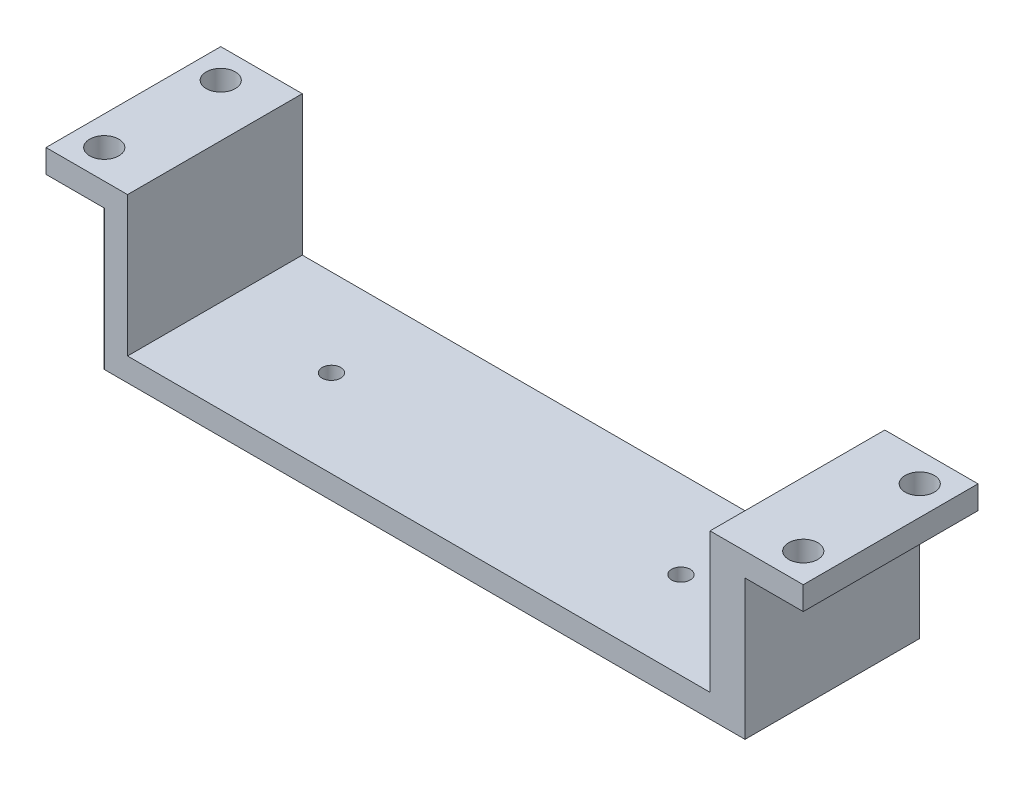
ISO-10303-21;
HEADER;
FILE_DESCRIPTION(('STEP AP214'),'2;1');
FILE_NAME('part.step','',(''),(''),'','','');
FILE_SCHEMA(('AUTOMOTIVE_DESIGN { 1 0 10303 214 1 1 1 1 }'));
ENDSEC;
DATA;
#1=APPLICATION_CONTEXT('core data for automotive mechanical design processes');
#2=APPLICATION_PROTOCOL_DEFINITION('international standard','automotive_design',2000,#1);
#3=PRODUCT_CONTEXT('',#1,'mechanical');
#4=PRODUCT('Part','Part','',(#3));
#5=PRODUCT_RELATED_PRODUCT_CATEGORY('part','',(#4));
#6=PRODUCT_DEFINITION_FORMATION('','',#4);
#7=PRODUCT_DEFINITION_CONTEXT('part definition',#1,'design');
#8=PRODUCT_DEFINITION('design','',#6,#7);
#9=PRODUCT_DEFINITION_SHAPE('','',#8);
#10=(LENGTH_UNIT() NAMED_UNIT(*) SI_UNIT(.MILLI.,.METRE.));
#11=(NAMED_UNIT(*) PLANE_ANGLE_UNIT() SI_UNIT($,.RADIAN.));
#12=(NAMED_UNIT(*) SI_UNIT($,.STERADIAN.) SOLID_ANGLE_UNIT());
#13=UNCERTAINTY_MEASURE_WITH_UNIT(LENGTH_MEASURE(1.E-05),#10,'distance_accuracy_value','');
#14=(GEOMETRIC_REPRESENTATION_CONTEXT(3) GLOBAL_UNCERTAINTY_ASSIGNED_CONTEXT((#13)) GLOBAL_UNIT_ASSIGNED_CONTEXT((#10,
#11,#12)) REPRESENTATION_CONTEXT('',''));
#15=CARTESIAN_POINT('',(0.,0.,0.));
#16=DIRECTION('',(0.,0.,1.));
#17=DIRECTION('',(1.,0.,0.));
#18=AXIS2_PLACEMENT_3D('',#15,#16,#17);
#19=CARTESIAN_POINT('',(0.,2.,15.));
#20=DIRECTION('',(0.,0.,-1.));
#21=DIRECTION('',(-1.,0.,0.));
#22=AXIS2_PLACEMENT_3D('',#19,#20,#21);
#23=PLANE('',#22);
#24=DIRECTION('',(1.,0.,0.));
#25=VECTOR('',#24,1.);
#26=CARTESIAN_POINT('',(0.,0.,15.));
#27=LINE('',#26,#25);
#28=CARTESIAN_POINT('',(-2.,0.,15.));
#29=VERTEX_POINT('',#28);
#30=CARTESIAN_POINT('',(53.0000000000001,0.,15.));
#31=VERTEX_POINT('',#30);
#32=EDGE_CURVE('E287',#29,#31,#27,.T.);
#33=ORIENTED_EDGE('',*,*,#32,.T.);
#34=DIRECTION('',(0.,-1.,0.));
#35=VECTOR('',#34,1.);
#36=CARTESIAN_POINT('',(53.0000000000001,14.,15.));
#37=LINE('',#36,#35);
#38=CARTESIAN_POINT('',(53.0000000000001,12.,15.));
#39=VERTEX_POINT('',#38);
#40=EDGE_CURVE('E261',#39,#31,#37,.T.);
#41=ORIENTED_EDGE('',*,*,#40,.F.);
#42=DIRECTION('',(-1.,0.,0.));
#43=VECTOR('',#42,1.);
#44=CARTESIAN_POINT('',(0.,12.,15.));
#45=LINE('',#44,#43);
#46=CARTESIAN_POINT('',(58.0000000000001,12.,15.));
#47=VERTEX_POINT('',#46);
#48=EDGE_CURVE('E206',#47,#39,#45,.T.);
#49=ORIENTED_EDGE('',*,*,#48,.F.);
#50=DIRECTION('',(0.,1.,0.));
#51=VECTOR('',#50,1.);
#52=CARTESIAN_POINT('',(58.0000000000001,12.,15.));
#53=LINE('',#52,#51);
#54=CARTESIAN_POINT('',(58.0000000000001,14.,15.));
#55=VERTEX_POINT('',#54);
#56=EDGE_CURVE('E219',#47,#55,#53,.T.);
#57=ORIENTED_EDGE('',*,*,#56,.T.);
#58=DIRECTION('',(1.,0.,0.));
#59=VECTOR('',#58,1.);
#60=CARTESIAN_POINT('',(0.,14.,15.));
#61=LINE('',#60,#59);
#62=CARTESIAN_POINT('',(50.,14.,15.));
#63=VERTEX_POINT('',#62);
#64=EDGE_CURVE('E259',#63,#55,#61,.T.);
#65=ORIENTED_EDGE('',*,*,#64,.F.);
#66=DIRECTION('',(0.,-1.,0.));
#67=VECTOR('',#66,1.);
#68=CARTESIAN_POINT('',(50.,14.,15.));
#69=LINE('',#68,#67);
#70=CARTESIAN_POINT('',(50.,2.,15.));
#71=VERTEX_POINT('',#70);
#72=EDGE_CURVE('E264',#63,#71,#69,.T.);
#73=ORIENTED_EDGE('',*,*,#72,.T.);
#74=DIRECTION('',(1.,0.,0.));
#75=VECTOR('',#74,1.);
#76=CARTESIAN_POINT('',(0.,2.,15.));
#77=LINE('',#76,#75);
#78=CARTESIAN_POINT('',(0.,2.,15.));
#79=VERTEX_POINT('',#78);
#80=EDGE_CURVE('E288',#79,#71,#77,.T.);
#81=ORIENTED_EDGE('',*,*,#80,.F.);
#82=DIRECTION('',(0.,-1.,0.));
#83=VECTOR('',#82,1.);
#84=CARTESIAN_POINT('',(0.,14.,15.));
#85=LINE('',#84,#83);
#86=CARTESIAN_POINT('',(0.,14.,15.));
#87=VERTEX_POINT('',#86);
#88=EDGE_CURVE('E281',#87,#79,#85,.T.);
#89=ORIENTED_EDGE('',*,*,#88,.F.);
#90=DIRECTION('',(-1.,0.,0.));
#91=VECTOR('',#90,1.);
#92=CARTESIAN_POINT('',(0.,14.,15.));
#93=LINE('',#92,#91);
#94=CARTESIAN_POINT('',(-7.,14.,15.));
#95=VERTEX_POINT('',#94);
#96=EDGE_CURVE('E271',#87,#95,#93,.T.);
#97=ORIENTED_EDGE('',*,*,#96,.T.);
#98=DIRECTION('',(0.,1.,0.));
#99=VECTOR('',#98,1.);
#100=CARTESIAN_POINT('',(-7.,12.,15.));
#101=LINE('',#100,#99);
#102=CARTESIAN_POINT('',(-7.,12.,15.));
#103=VERTEX_POINT('',#102);
#104=EDGE_CURVE('E250',#103,#95,#101,.T.);
#105=ORIENTED_EDGE('',*,*,#104,.F.);
#106=DIRECTION('',(1.,0.,0.));
#107=VECTOR('',#106,1.);
#108=CARTESIAN_POINT('',(0.,12.,15.));
#109=LINE('',#108,#107);
#110=CARTESIAN_POINT('',(-2.,12.,15.));
#111=VERTEX_POINT('',#110);
#112=EDGE_CURVE('E244',#103,#111,#109,.T.);
#113=ORIENTED_EDGE('',*,*,#112,.T.);
#114=DIRECTION('',(0.,-1.,0.));
#115=VECTOR('',#114,1.);
#116=CARTESIAN_POINT('',(-2.,14.,15.));
#117=LINE('',#116,#115);
#118=EDGE_CURVE('E283',#111,#29,#117,.T.);
#119=ORIENTED_EDGE('',*,*,#118,.T.);
#120=EDGE_LOOP('',(#33,#41,#49,#57,#65,#73,#81,#89,#97,#105,#113,#119));
#121=FACE_BOUND('',#120,.T.);
#122=ADVANCED_FACE('F101',(#121),#23,.F.);
#123=CARTESIAN_POINT('',(0.,2.,0.));
#124=DIRECTION('',(0.,0.,-1.));
#125=DIRECTION('',(-1.,0.,0.));
#126=AXIS2_PLACEMENT_3D('',#123,#124,#125);
#127=PLANE('',#126);
#128=DIRECTION('',(1.,0.,0.));
#129=VECTOR('',#128,1.);
#130=CARTESIAN_POINT('',(0.,0.,0.));
#131=LINE('',#130,#129);
#132=CARTESIAN_POINT('',(-2.,0.,0.));
#133=VERTEX_POINT('',#132);
#134=CARTESIAN_POINT('',(53.0000000000001,0.,0.));
#135=VERTEX_POINT('',#134);
#136=EDGE_CURVE('E303',#133,#135,#131,.T.);
#137=ORIENTED_EDGE('',*,*,#136,.F.);
#138=DIRECTION('',(0.,-1.,0.));
#139=VECTOR('',#138,1.);
#140=CARTESIAN_POINT('',(-2.,14.,0.));
#141=LINE('',#140,#139);
#142=CARTESIAN_POINT('',(-2.,12.,0.));
#143=VERTEX_POINT('',#142);
#144=EDGE_CURVE('E285',#143,#133,#141,.T.);
#145=ORIENTED_EDGE('',*,*,#144,.F.);
#146=DIRECTION('',(1.,0.,0.));
#147=VECTOR('',#146,1.);
#148=CARTESIAN_POINT('',(0.,12.,0.));
#149=LINE('',#148,#147);
#150=CARTESIAN_POINT('',(-7.,12.,0.));
#151=VERTEX_POINT('',#150);
#152=EDGE_CURVE('E125',#151,#143,#149,.T.);
#153=ORIENTED_EDGE('',*,*,#152,.F.);
#154=DIRECTION('',(0.,1.,0.));
#155=VECTOR('',#154,1.);
#156=CARTESIAN_POINT('',(-7.,12.,0.));
#157=LINE('',#156,#155);
#158=CARTESIAN_POINT('',(-7.,14.,0.));
#159=VERTEX_POINT('',#158);
#160=EDGE_CURVE('E247',#151,#159,#157,.T.);
#161=ORIENTED_EDGE('',*,*,#160,.T.);
#162=DIRECTION('',(-1.,0.,0.));
#163=VECTOR('',#162,1.);
#164=CARTESIAN_POINT('',(0.,14.,0.));
#165=LINE('',#164,#163);
#166=CARTESIAN_POINT('',(0.,14.,0.));
#167=VERTEX_POINT('',#166);
#168=EDGE_CURVE('E269',#167,#159,#165,.T.);
#169=ORIENTED_EDGE('',*,*,#168,.F.);
#170=DIRECTION('',(0.,-1.,0.));
#171=VECTOR('',#170,1.);
#172=CARTESIAN_POINT('',(0.,14.,0.));
#173=LINE('',#172,#171);
#174=CARTESIAN_POINT('',(0.,2.,0.));
#175=VERTEX_POINT('',#174);
#176=EDGE_CURVE('E276',#167,#175,#173,.T.);
#177=ORIENTED_EDGE('',*,*,#176,.T.);
#178=DIRECTION('',(1.,0.,0.));
#179=VECTOR('',#178,1.);
#180=CARTESIAN_POINT('',(0.,2.,0.));
#181=LINE('',#180,#179);
#182=CARTESIAN_POINT('',(50.,2.,0.));
#183=VERTEX_POINT('',#182);
#184=EDGE_CURVE('E293',#175,#183,#181,.T.);
#185=ORIENTED_EDGE('',*,*,#184,.T.);
#186=DIRECTION('',(0.,-1.,0.));
#187=VECTOR('',#186,1.);
#188=CARTESIAN_POINT('',(50.,14.,0.));
#189=LINE('',#188,#187);
#190=CARTESIAN_POINT('',(50.,14.,0.));
#191=VERTEX_POINT('',#190);
#192=EDGE_CURVE('E198',#191,#183,#189,.T.);
#193=ORIENTED_EDGE('',*,*,#192,.F.);
#194=DIRECTION('',(1.,0.,0.));
#195=VECTOR('',#194,1.);
#196=CARTESIAN_POINT('',(0.,14.,0.));
#197=LINE('',#196,#195);
#198=CARTESIAN_POINT('',(58.0000000000001,14.,0.));
#199=VERTEX_POINT('',#198);
#200=EDGE_CURVE('E255',#191,#199,#197,.T.);
#201=ORIENTED_EDGE('',*,*,#200,.T.);
#202=DIRECTION('',(0.,1.,0.));
#203=VECTOR('',#202,1.);
#204=CARTESIAN_POINT('',(58.0000000000001,12.,0.));
#205=LINE('',#204,#203);
#206=CARTESIAN_POINT('',(58.0000000000001,12.,0.));
#207=VERTEX_POINT('',#206);
#208=EDGE_CURVE('E211',#207,#199,#205,.T.);
#209=ORIENTED_EDGE('',*,*,#208,.F.);
#210=DIRECTION('',(-1.,0.,0.));
#211=VECTOR('',#210,1.);
#212=CARTESIAN_POINT('',(0.,12.,0.));
#213=LINE('',#212,#211);
#214=CARTESIAN_POINT('',(53.0000000000001,12.,0.));
#215=VERTEX_POINT('',#214);
#216=EDGE_CURVE('E204',#207,#215,#213,.T.);
#217=ORIENTED_EDGE('',*,*,#216,.T.);
#218=DIRECTION('',(0.,-1.,0.));
#219=VECTOR('',#218,1.);
#220=CARTESIAN_POINT('',(53.0000000000001,14.,0.));
#221=LINE('',#220,#219);
#222=EDGE_CURVE('E189',#215,#135,#221,.T.);
#223=ORIENTED_EDGE('',*,*,#222,.T.);
#224=EDGE_LOOP('',(#137,#145,#153,#161,#169,#177,#185,#193,#201,#209,#217,#223));
#225=FACE_BOUND('',#224,.T.);
#226=ADVANCED_FACE('F209',(#225),#127,.T.);
#227=CARTESIAN_POINT('',(40.,2.,7.5));
#228=DIRECTION('',(0.,-1.,0.));
#229=DIRECTION('',(0.,0.,-1.));
#230=AXIS2_PLACEMENT_3D('',#227,#228,#229);
#231=CYLINDRICAL_SURFACE('',#230,0.800000000000002);
#232=CARTESIAN_POINT('',(40.,2.,7.5));
#233=DIRECTION('',(0.,1.,0.));
#234=DIRECTION('',(0.,0.,1.));
#235=AXIS2_PLACEMENT_3D('',#232,#233,#234);
#236=CIRCLE('',#235,0.800000000000002);
#237=CARTESIAN_POINT('',(40.,2.,8.3));
#238=VERTEX_POINT('',#237);
#239=EDGE_CURVE('E109',#238,#238,#236,.T.);
#240=ORIENTED_EDGE('',*,*,#239,.T.);
#241=EDGE_LOOP('',(#240));
#242=FACE_BOUND('',#241,.T.);
#243=CARTESIAN_POINT('',(40.,0.,7.5));
#244=DIRECTION('',(0.,1.,0.));
#245=DIRECTION('',(0.,0.,1.));
#246=AXIS2_PLACEMENT_3D('',#243,#244,#245);
#247=CIRCLE('',#246,0.800000000000002);
#248=CARTESIAN_POINT('',(40.,0.,8.3));
#249=VERTEX_POINT('',#248);
#250=EDGE_CURVE('E304',#249,#249,#247,.T.);
#251=ORIENTED_EDGE('',*,*,#250,.F.);
#252=EDGE_LOOP('',(#251));
#253=FACE_BOUND('',#252,.T.);
#254=ADVANCED_FACE('F316',(#242,#253),#231,.F.);
#255=CARTESIAN_POINT('',(10.,2.,7.5));
#256=DIRECTION('',(0.,-1.,0.));
#257=DIRECTION('',(0.,0.,-1.));
#258=AXIS2_PLACEMENT_3D('',#255,#256,#257);
#259=CYLINDRICAL_SURFACE('',#258,0.800000000000001);
#260=CARTESIAN_POINT('',(10.,2.,7.5));
#261=DIRECTION('',(0.,1.,0.));
#262=DIRECTION('',(0.,0.,1.));
#263=AXIS2_PLACEMENT_3D('',#260,#261,#262);
#264=CIRCLE('',#263,0.800000000000001);
#265=CARTESIAN_POINT('',(10.,2.,8.3));
#266=VERTEX_POINT('',#265);
#267=EDGE_CURVE('E12',#266,#266,#264,.T.);
#268=ORIENTED_EDGE('',*,*,#267,.T.);
#269=EDGE_LOOP('',(#268));
#270=FACE_BOUND('',#269,.T.);
#271=CARTESIAN_POINT('',(10.,0.,7.5));
#272=DIRECTION('',(0.,1.,0.));
#273=DIRECTION('',(0.,0.,1.));
#274=AXIS2_PLACEMENT_3D('',#271,#272,#273);
#275=CIRCLE('',#274,0.800000000000001);
#276=CARTESIAN_POINT('',(10.,0.,8.3));
#277=VERTEX_POINT('',#276);
#278=EDGE_CURVE('E104',#277,#277,#275,.T.);
#279=ORIENTED_EDGE('',*,*,#278,.F.);
#280=EDGE_LOOP('',(#279));
#281=FACE_BOUND('',#280,.T.);
#282=ADVANCED_FACE('F313',(#270,#281),#259,.F.);
#283=CARTESIAN_POINT('',(0.,2.,0.));
#284=DIRECTION('',(0.,1.,0.));
#285=DIRECTION('',(0.,0.,1.));
#286=AXIS2_PLACEMENT_3D('',#283,#284,#285);
#287=PLANE('',#286);
#288=ORIENTED_EDGE('',*,*,#80,.T.);
#289=DIRECTION('',(0.,0.,1.));
#290=VECTOR('',#289,1.);
#291=CARTESIAN_POINT('',(50.,2.,0.));
#292=LINE('',#291,#290);
#293=EDGE_CURVE('E290',#183,#71,#292,.T.);
#294=ORIENTED_EDGE('',*,*,#293,.F.);
#295=ORIENTED_EDGE('',*,*,#184,.F.);
#296=DIRECTION('',(0.,0.,1.));
#297=VECTOR('',#296,1.);
#298=CARTESIAN_POINT('',(0.,2.,0.));
#299=LINE('',#298,#297);
#300=EDGE_CURVE('E296',#175,#79,#299,.T.);
#301=ORIENTED_EDGE('',*,*,#300,.T.);
#302=EDGE_LOOP('',(#288,#294,#295,#301));
#303=FACE_BOUND('',#302,.T.);
#304=ORIENTED_EDGE('',*,*,#239,.F.);
#305=EDGE_LOOP('',(#304));
#306=FACE_BOUND('',#305,.T.);
#307=ORIENTED_EDGE('',*,*,#267,.F.);
#308=EDGE_LOOP('',(#307));
#309=FACE_BOUND('',#308,.T.);
#310=ADVANCED_FACE('F315',(#303,#306,#309),#287,.T.);
#311=CARTESIAN_POINT('',(0.,0.,0.));
#312=DIRECTION('',(0.,1.,0.));
#313=DIRECTION('',(0.,0.,1.));
#314=AXIS2_PLACEMENT_3D('',#311,#312,#313);
#315=PLANE('',#314);
#316=ORIENTED_EDGE('',*,*,#32,.F.);
#317=DIRECTION('',(0.,0.,1.));
#318=VECTOR('',#317,1.);
#319=CARTESIAN_POINT('',(-2.,0.,0.));
#320=LINE('',#319,#318);
#321=EDGE_CURVE('E197',#133,#29,#320,.T.);
#322=ORIENTED_EDGE('',*,*,#321,.F.);
#323=ORIENTED_EDGE('',*,*,#136,.T.);
#324=DIRECTION('',(0.,0.,1.));
#325=VECTOR('',#324,1.);
#326=CARTESIAN_POINT('',(53.0000000000001,0.,0.));
#327=LINE('',#326,#325);
#328=EDGE_CURVE('E192',#135,#31,#327,.T.);
#329=ORIENTED_EDGE('',*,*,#328,.T.);
#330=EDGE_LOOP('',(#316,#322,#323,#329));
#331=FACE_BOUND('',#330,.T.);
#332=ORIENTED_EDGE('',*,*,#250,.T.);
#333=EDGE_LOOP('',(#332));
#334=FACE_BOUND('',#333,.T.);
#335=ORIENTED_EDGE('',*,*,#278,.T.);
#336=EDGE_LOOP('',(#335));
#337=FACE_BOUND('',#336,.T.);
#338=ADVANCED_FACE('F311',(#331,#334,#337),#315,.F.);
#339=CARTESIAN_POINT('',(0.,14.,0.));
#340=DIRECTION('',(1.,0.,0.));
#341=DIRECTION('',(0.,0.,-1.));
#342=AXIS2_PLACEMENT_3D('',#339,#340,#341);
#343=PLANE('',#342);
#344=ORIENTED_EDGE('',*,*,#300,.F.);
#345=ORIENTED_EDGE('',*,*,#176,.F.);
#346=DIRECTION('',(0.,0.,1.));
#347=VECTOR('',#346,1.);
#348=CARTESIAN_POINT('',(0.,14.,0.));
#349=LINE('',#348,#347);
#350=EDGE_CURVE('E273',#167,#87,#349,.T.);
#351=ORIENTED_EDGE('',*,*,#350,.T.);
#352=ORIENTED_EDGE('',*,*,#88,.T.);
#353=EDGE_LOOP('',(#344,#345,#351,#352));
#354=FACE_BOUND('',#353,.T.);
#355=ADVANCED_FACE('F355',(#354),#343,.T.);
#356=CARTESIAN_POINT('',(-2.,14.,0.));
#357=DIRECTION('',(1.,0.,0.));
#358=DIRECTION('',(0.,0.,-1.));
#359=AXIS2_PLACEMENT_3D('',#356,#357,#358);
#360=PLANE('',#359);
#361=ORIENTED_EDGE('',*,*,#118,.F.);
#362=DIRECTION('',(0.,0.,-1.));
#363=VECTOR('',#362,1.);
#364=CARTESIAN_POINT('',(-2.,12.,0.));
#365=LINE('',#364,#363);
#366=EDGE_CURVE('E239',#111,#143,#365,.T.);
#367=ORIENTED_EDGE('',*,*,#366,.T.);
#368=ORIENTED_EDGE('',*,*,#144,.T.);
#369=ORIENTED_EDGE('',*,*,#321,.T.);
#370=EDGE_LOOP('',(#361,#367,#368,#369));
#371=FACE_BOUND('',#370,.T.);
#372=ADVANCED_FACE('F339',(#371),#360,.F.);
#373=CARTESIAN_POINT('',(0.,14.,0.));
#374=DIRECTION('',(0.,1.,0.));
#375=DIRECTION('',(0.,0.,1.));
#376=AXIS2_PLACEMENT_3D('',#373,#374,#375);
#377=PLANE('',#376);
#378=ORIENTED_EDGE('',*,*,#168,.T.);
#379=DIRECTION('',(0.,0.,-1.));
#380=VECTOR('',#379,1.);
#381=CARTESIAN_POINT('',(-7.,14.,0.));
#382=LINE('',#381,#380);
#383=EDGE_CURVE('E236',#95,#159,#382,.T.);
#384=ORIENTED_EDGE('',*,*,#383,.F.);
#385=ORIENTED_EDGE('',*,*,#96,.F.);
#386=ORIENTED_EDGE('',*,*,#350,.F.);
#387=EDGE_LOOP('',(#378,#384,#385,#386));
#388=FACE_BOUND('',#387,.T.);
#389=CARTESIAN_POINT('',(-4.5,14.,12.5));
#390=DIRECTION('',(0.,1.,0.));
#391=DIRECTION('',(0.,0.,1.));
#392=AXIS2_PLACEMENT_3D('',#389,#390,#391);
#393=CIRCLE('',#392,1.25);
#394=CARTESIAN_POINT('',(-4.5,14.,13.75));
#395=VERTEX_POINT('',#394);
#396=EDGE_CURVE('E226',#395,#395,#393,.T.);
#397=ORIENTED_EDGE('',*,*,#396,.F.);
#398=EDGE_LOOP('',(#397));
#399=FACE_BOUND('',#398,.T.);
#400=CARTESIAN_POINT('',(-4.5,14.,2.5));
#401=DIRECTION('',(0.,1.,0.));
#402=DIRECTION('',(0.,0.,1.));
#403=AXIS2_PLACEMENT_3D('',#400,#401,#402);
#404=CIRCLE('',#403,1.25);
#405=CARTESIAN_POINT('',(-4.5,14.,3.75));
#406=VERTEX_POINT('',#405);
#407=EDGE_CURVE('E230',#406,#406,#404,.T.);
#408=ORIENTED_EDGE('',*,*,#407,.F.);
#409=EDGE_LOOP('',(#408));
#410=FACE_BOUND('',#409,.T.);
#411=ADVANCED_FACE('F352',(#388,#399,#410),#377,.T.);
#412=CARTESIAN_POINT('',(50.,14.,0.));
#413=DIRECTION('',(1.,0.,0.));
#414=DIRECTION('',(0.,0.,-1.));
#415=AXIS2_PLACEMENT_3D('',#412,#413,#414);
#416=PLANE('',#415);
#417=ORIENTED_EDGE('',*,*,#192,.T.);
#418=ORIENTED_EDGE('',*,*,#293,.T.);
#419=ORIENTED_EDGE('',*,*,#72,.F.);
#420=DIRECTION('',(0.,0.,1.));
#421=VECTOR('',#420,1.);
#422=CARTESIAN_POINT('',(50.,14.,0.));
#423=LINE('',#422,#421);
#424=EDGE_CURVE('E257',#191,#63,#423,.T.);
#425=ORIENTED_EDGE('',*,*,#424,.F.);
#426=EDGE_LOOP('',(#417,#418,#419,#425));
#427=FACE_BOUND('',#426,.T.);
#428=ADVANCED_FACE('F362',(#427),#416,.F.);
#429=CARTESIAN_POINT('',(53.0000000000001,14.,0.));
#430=DIRECTION('',(1.,0.,0.));
#431=DIRECTION('',(0.,0.,-1.));
#432=AXIS2_PLACEMENT_3D('',#429,#430,#431);
#433=PLANE('',#432);
#434=DIRECTION('',(0.,0.,-1.));
#435=VECTOR('',#434,1.);
#436=CARTESIAN_POINT('',(53.0000000000001,12.,0.));
#437=LINE('',#436,#435);
#438=EDGE_CURVE('E117',#39,#215,#437,.T.);
#439=ORIENTED_EDGE('',*,*,#438,.F.);
#440=ORIENTED_EDGE('',*,*,#40,.T.);
#441=ORIENTED_EDGE('',*,*,#328,.F.);
#442=ORIENTED_EDGE('',*,*,#222,.F.);
#443=EDGE_LOOP('',(#439,#440,#441,#442));
#444=FACE_BOUND('',#443,.T.);
#445=ADVANCED_FACE('F190',(#444),#433,.T.);
#446=CARTESIAN_POINT('',(0.,14.,0.));
#447=DIRECTION('',(0.,1.,0.));
#448=DIRECTION('',(0.,0.,1.));
#449=AXIS2_PLACEMENT_3D('',#446,#447,#448);
#450=PLANE('',#449);
#451=ORIENTED_EDGE('',*,*,#64,.T.);
#452=DIRECTION('',(0.,0.,1.));
#453=VECTOR('',#452,1.);
#454=CARTESIAN_POINT('',(58.0000000000001,14.,0.));
#455=LINE('',#454,#453);
#456=EDGE_CURVE('E207',#199,#55,#455,.T.);
#457=ORIENTED_EDGE('',*,*,#456,.F.);
#458=ORIENTED_EDGE('',*,*,#200,.F.);
#459=ORIENTED_EDGE('',*,*,#424,.T.);
#460=EDGE_LOOP('',(#451,#457,#458,#459));
#461=FACE_BOUND('',#460,.T.);
#462=CARTESIAN_POINT('',(55.5000000000001,14.,2.49999999999999));
#463=DIRECTION('',(0.,1.,0.));
#464=DIRECTION('',(0.,0.,1.));
#465=AXIS2_PLACEMENT_3D('',#462,#463,#464);
#466=CIRCLE('',#465,1.25);
#467=CARTESIAN_POINT('',(55.5000000000001,14.,3.75));
#468=VERTEX_POINT('',#467);
#469=EDGE_CURVE('E376',#468,#468,#466,.T.);
#470=ORIENTED_EDGE('',*,*,#469,.F.);
#471=EDGE_LOOP('',(#470));
#472=FACE_BOUND('',#471,.T.);
#473=CARTESIAN_POINT('',(55.5,14.,12.5));
#474=DIRECTION('',(0.,1.,0.));
#475=DIRECTION('',(0.,0.,1.));
#476=AXIS2_PLACEMENT_3D('',#473,#474,#475);
#477=CIRCLE('',#476,1.25);
#478=CARTESIAN_POINT('',(55.5,14.,13.75));
#479=VERTEX_POINT('',#478);
#480=EDGE_CURVE('E379',#479,#479,#477,.T.);
#481=ORIENTED_EDGE('',*,*,#480,.F.);
#482=EDGE_LOOP('',(#481));
#483=FACE_BOUND('',#482,.T.);
#484=ADVANCED_FACE('F369',(#461,#472,#483),#450,.T.);
#485=CARTESIAN_POINT('',(-7.,12.,0.));
#486=DIRECTION('',(1.,0.,0.));
#487=DIRECTION('',(0.,0.,-1.));
#488=AXIS2_PLACEMENT_3D('',#485,#486,#487);
#489=PLANE('',#488);
#490=ORIENTED_EDGE('',*,*,#383,.T.);
#491=ORIENTED_EDGE('',*,*,#160,.F.);
#492=DIRECTION('',(0.,0.,-1.));
#493=VECTOR('',#492,1.);
#494=CARTESIAN_POINT('',(-7.,12.,0.));
#495=LINE('',#494,#493);
#496=EDGE_CURVE('E242',#103,#151,#495,.T.);
#497=ORIENTED_EDGE('',*,*,#496,.F.);
#498=ORIENTED_EDGE('',*,*,#104,.T.);
#499=EDGE_LOOP('',(#490,#491,#497,#498));
#500=FACE_BOUND('',#499,.T.);
#501=ADVANCED_FACE('F347',(#500),#489,.F.);
#502=CARTESIAN_POINT('',(0.,12.,0.));
#503=DIRECTION('',(0.,-1.,0.));
#504=DIRECTION('',(0.,0.,-1.));
#505=AXIS2_PLACEMENT_3D('',#502,#503,#504);
#506=PLANE('',#505);
#507=CARTESIAN_POINT('',(-4.5,12.,12.5));
#508=DIRECTION('',(0.,1.,0.));
#509=DIRECTION('',(0.,0.,1.));
#510=AXIS2_PLACEMENT_3D('',#507,#508,#509);
#511=CIRCLE('',#510,1.25);
#512=CARTESIAN_POINT('',(-4.5,12.,13.75));
#513=VERTEX_POINT('',#512);
#514=EDGE_CURVE('E227',#513,#513,#511,.T.);
#515=ORIENTED_EDGE('',*,*,#514,.T.);
#516=EDGE_LOOP('',(#515));
#517=FACE_BOUND('',#516,.T.);
#518=CARTESIAN_POINT('',(-4.5,12.,2.5));
#519=DIRECTION('',(0.,1.,0.));
#520=DIRECTION('',(0.,0.,1.));
#521=AXIS2_PLACEMENT_3D('',#518,#519,#520);
#522=CIRCLE('',#521,1.25);
#523=CARTESIAN_POINT('',(-4.5,12.,3.75));
#524=VERTEX_POINT('',#523);
#525=EDGE_CURVE('E233',#524,#524,#522,.T.);
#526=ORIENTED_EDGE('',*,*,#525,.T.);
#527=EDGE_LOOP('',(#526));
#528=FACE_BOUND('',#527,.T.);
#529=ORIENTED_EDGE('',*,*,#366,.F.);
#530=ORIENTED_EDGE('',*,*,#112,.F.);
#531=ORIENTED_EDGE('',*,*,#496,.T.);
#532=ORIENTED_EDGE('',*,*,#152,.T.);
#533=EDGE_LOOP('',(#529,#530,#531,#532));
#534=FACE_BOUND('',#533,.T.);
#535=ADVANCED_FACE('F341',(#517,#528,#534),#506,.T.);
#536=CARTESIAN_POINT('',(-4.5,12.,2.5));
#537=DIRECTION('',(0.,1.,0.));
#538=DIRECTION('',(0.,0.,1.));
#539=AXIS2_PLACEMENT_3D('',#536,#537,#538);
#540=CYLINDRICAL_SURFACE('',#539,1.25);
#541=ORIENTED_EDGE('',*,*,#525,.F.);
#542=EDGE_LOOP('',(#541));
#543=FACE_BOUND('',#542,.T.);
#544=ORIENTED_EDGE('',*,*,#407,.T.);
#545=EDGE_LOOP('',(#544));
#546=FACE_BOUND('',#545,.T.);
#547=ADVANCED_FACE('F408',(#543,#546),#540,.F.);
#548=CARTESIAN_POINT('',(-4.5,12.,12.5));
#549=DIRECTION('',(0.,1.,0.));
#550=DIRECTION('',(0.,0.,1.));
#551=AXIS2_PLACEMENT_3D('',#548,#549,#550);
#552=CYLINDRICAL_SURFACE('',#551,1.25);
#553=ORIENTED_EDGE('',*,*,#514,.F.);
#554=EDGE_LOOP('',(#553));
#555=FACE_BOUND('',#554,.T.);
#556=ORIENTED_EDGE('',*,*,#396,.T.);
#557=EDGE_LOOP('',(#556));
#558=FACE_BOUND('',#557,.T.);
#559=ADVANCED_FACE('F405',(#555,#558),#552,.F.);
#560=CARTESIAN_POINT('',(58.0000000000001,12.,0.));
#561=DIRECTION('',(-1.,0.,0.));
#562=DIRECTION('',(0.,0.,1.));
#563=AXIS2_PLACEMENT_3D('',#560,#561,#562);
#564=PLANE('',#563);
#565=ORIENTED_EDGE('',*,*,#456,.T.);
#566=ORIENTED_EDGE('',*,*,#56,.F.);
#567=DIRECTION('',(0.,0.,1.));
#568=VECTOR('',#567,1.);
#569=CARTESIAN_POINT('',(58.0000000000001,12.,0.));
#570=LINE('',#569,#568);
#571=EDGE_CURVE('E213',#207,#47,#570,.T.);
#572=ORIENTED_EDGE('',*,*,#571,.F.);
#573=ORIENTED_EDGE('',*,*,#208,.T.);
#574=EDGE_LOOP('',(#565,#566,#572,#573));
#575=FACE_BOUND('',#574,.T.);
#576=ADVANCED_FACE('F367',(#575),#564,.F.);
#577=CARTESIAN_POINT('',(0.,12.,0.));
#578=DIRECTION('',(0.,1.,0.));
#579=DIRECTION('',(0.,0.,1.));
#580=AXIS2_PLACEMENT_3D('',#577,#578,#579);
#581=PLANE('',#580);
#582=CARTESIAN_POINT('',(55.5000000000001,12.,2.49999999999999));
#583=DIRECTION('',(0.,1.,0.));
#584=DIRECTION('',(0.,0.,1.));
#585=AXIS2_PLACEMENT_3D('',#582,#583,#584);
#586=CIRCLE('',#585,1.25);
#587=CARTESIAN_POINT('',(55.5000000000001,12.,3.75));
#588=VERTEX_POINT('',#587);
#589=EDGE_CURVE('E381',#588,#588,#586,.T.);
#590=ORIENTED_EDGE('',*,*,#589,.T.);
#591=EDGE_LOOP('',(#590));
#592=FACE_BOUND('',#591,.T.);
#593=CARTESIAN_POINT('',(55.5,12.,12.5));
#594=DIRECTION('',(0.,1.,0.));
#595=DIRECTION('',(0.,0.,1.));
#596=AXIS2_PLACEMENT_3D('',#593,#594,#595);
#597=CIRCLE('',#596,1.25);
#598=CARTESIAN_POINT('',(55.5,12.,13.75));
#599=VERTEX_POINT('',#598);
#600=EDGE_CURVE('E222',#599,#599,#597,.T.);
#601=ORIENTED_EDGE('',*,*,#600,.T.);
#602=EDGE_LOOP('',(#601));
#603=FACE_BOUND('',#602,.T.);
#604=ORIENTED_EDGE('',*,*,#438,.T.);
#605=ORIENTED_EDGE('',*,*,#216,.F.);
#606=ORIENTED_EDGE('',*,*,#571,.T.);
#607=ORIENTED_EDGE('',*,*,#48,.T.);
#608=EDGE_LOOP('',(#604,#605,#606,#607));
#609=FACE_BOUND('',#608,.T.);
#610=ADVANCED_FACE('F203',(#592,#603,#609),#581,.F.);
#611=CARTESIAN_POINT('',(55.5,12.,12.5));
#612=DIRECTION('',(0.,1.,0.));
#613=DIRECTION('',(0.,0.,1.));
#614=AXIS2_PLACEMENT_3D('',#611,#612,#613);
#615=CYLINDRICAL_SURFACE('',#614,1.25);
#616=ORIENTED_EDGE('',*,*,#600,.F.);
#617=EDGE_LOOP('',(#616));
#618=FACE_BOUND('',#617,.T.);
#619=ORIENTED_EDGE('',*,*,#480,.T.);
#620=EDGE_LOOP('',(#619));
#621=FACE_BOUND('',#620,.T.);
#622=ADVANCED_FACE('F390',(#618,#621),#615,.F.);
#623=CARTESIAN_POINT('',(55.5000000000001,12.,2.49999999999999));
#624=DIRECTION('',(0.,1.,0.));
#625=DIRECTION('',(0.,0.,1.));
#626=AXIS2_PLACEMENT_3D('',#623,#624,#625);
#627=CYLINDRICAL_SURFACE('',#626,1.25);
#628=ORIENTED_EDGE('',*,*,#589,.F.);
#629=EDGE_LOOP('',(#628));
#630=FACE_BOUND('',#629,.T.);
#631=ORIENTED_EDGE('',*,*,#469,.T.);
#632=EDGE_LOOP('',(#631));
#633=FACE_BOUND('',#632,.T.);
#634=ADVANCED_FACE('F388',(#630,#633),#627,.F.);
#635=CLOSED_SHELL('',(#122,#226,#254,#282,#310,#338,#355,#372,#411,#428,#445,#484,#501,#535,
#547,#559,#576,#610,#622,#634));
#636=MANIFOLD_SOLID_BREP('B2',#635);
#637=ADVANCED_BREP_SHAPE_REPRESENTATION('',(#18,#636),#14);
#638=SHAPE_DEFINITION_REPRESENTATION(#9,#637);
ENDSEC;
END-ISO-10303-21;
